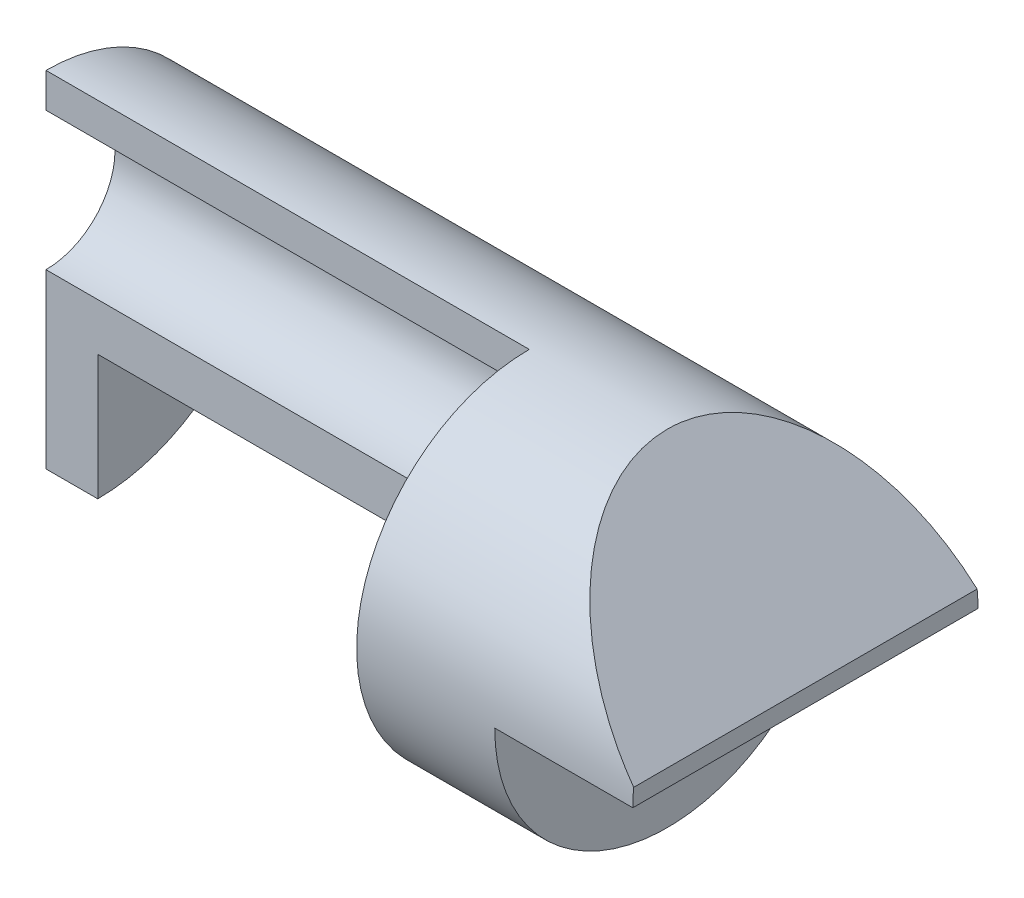
ISO-10303-21;
HEADER;
FILE_DESCRIPTION(('STEP AP214'),'2;1');
FILE_NAME('part.step','',(''),(''),'','','');
FILE_SCHEMA(('AUTOMOTIVE_DESIGN { 1 0 10303 214 1 1 1 1 }'));
ENDSEC;
DATA;
#1=APPLICATION_CONTEXT('core data for automotive mechanical design processes');
#2=APPLICATION_PROTOCOL_DEFINITION('international standard','automotive_design',2000,#1);
#3=PRODUCT_CONTEXT('',#1,'mechanical');
#4=PRODUCT('Part','Part','',(#3));
#5=PRODUCT_RELATED_PRODUCT_CATEGORY('part','',(#4));
#6=PRODUCT_DEFINITION_FORMATION('','',#4);
#7=PRODUCT_DEFINITION_CONTEXT('part definition',#1,'design');
#8=PRODUCT_DEFINITION('design','',#6,#7);
#9=PRODUCT_DEFINITION_SHAPE('','',#8);
#10=(LENGTH_UNIT() NAMED_UNIT(*) SI_UNIT(.MILLI.,.METRE.));
#11=(NAMED_UNIT(*) PLANE_ANGLE_UNIT() SI_UNIT($,.RADIAN.));
#12=(NAMED_UNIT(*) SI_UNIT($,.STERADIAN.) SOLID_ANGLE_UNIT());
#13=UNCERTAINTY_MEASURE_WITH_UNIT(LENGTH_MEASURE(1.E-05),#10,'distance_accuracy_value','');
#14=(GEOMETRIC_REPRESENTATION_CONTEXT(3) GLOBAL_UNCERTAINTY_ASSIGNED_CONTEXT((#13)) GLOBAL_UNIT_ASSIGNED_CONTEXT((#10,
#11,#12)) REPRESENTATION_CONTEXT('',''));
#15=CARTESIAN_POINT('',(0.,0.,0.));
#16=DIRECTION('',(0.,0.,1.));
#17=DIRECTION('',(1.,0.,0.));
#18=AXIS2_PLACEMENT_3D('',#15,#16,#17);
#19=CARTESIAN_POINT('',(0.,-5.,0.));
#20=DIRECTION('',(0.,0.,1.));
#21=DIRECTION('',(1.,0.,0.));
#22=AXIS2_PLACEMENT_3D('',#19,#20,#21);
#23=PLANE('',#22);
#24=DIRECTION('',(1.,0.,0.));
#25=VECTOR('',#24,1.);
#26=CARTESIAN_POINT('',(0.,-5.,0.));
#27=LINE('',#26,#25);
#28=CARTESIAN_POINT('',(0.,-5.,0.));
#29=VERTEX_POINT('',#28);
#30=CARTESIAN_POINT('',(1.5,-5.,0.));
#31=VERTEX_POINT('',#30);
#32=EDGE_CURVE('E135',#29,#31,#27,.T.);
#33=ORIENTED_EDGE('',*,*,#32,.T.);
#34=DIRECTION('',(0.,1.,0.));
#35=VECTOR('',#34,1.);
#36=CARTESIAN_POINT('',(1.5,-5.,0.));
#37=LINE('',#36,#35);
#38=CARTESIAN_POINT('',(1.5,-1.37208889847052,0.));
#39=VERTEX_POINT('',#38);
#40=EDGE_CURVE('E121',#31,#39,#37,.T.);
#41=ORIENTED_EDGE('',*,*,#40,.T.);
#42=DIRECTION('',(1.,0.,0.));
#43=VECTOR('',#42,1.);
#44=CARTESIAN_POINT('',(1.5,-1.37208889847052,0.));
#45=LINE('',#44,#43);
#46=CARTESIAN_POINT('',(12.,-1.37208889847052,0.));
#47=VERTEX_POINT('',#46);
#48=EDGE_CURVE('E127',#39,#47,#45,.T.);
#49=ORIENTED_EDGE('',*,*,#48,.T.);
#50=DIRECTION('',(0.,-1.,0.));
#51=VECTOR('',#50,1.);
#52=CARTESIAN_POINT('',(12.,-1.37208889847052,0.));
#53=LINE('',#52,#51);
#54=CARTESIAN_POINT('',(12.,-5.,0.));
#55=VERTEX_POINT('',#54);
#56=EDGE_CURVE('E131',#47,#55,#53,.T.);
#57=ORIENTED_EDGE('',*,*,#56,.T.);
#58=CARTESIAN_POINT('',(14.,-5.,0.));
#59=VERTEX_POINT('',#58);
#60=EDGE_CURVE('E152',#55,#59,#27,.T.);
#61=ORIENTED_EDGE('',*,*,#60,.T.);
#62=DIRECTION('',(0.,1.,0.));
#63=VECTOR('',#62,1.);
#64=CARTESIAN_POINT('',(14.,-5.,0.));
#65=LINE('',#64,#63);
#66=CARTESIAN_POINT('',(14.,0.,0.));
#67=VERTEX_POINT('',#66);
#68=EDGE_CURVE('E160',#59,#67,#65,.T.);
#69=ORIENTED_EDGE('',*,*,#68,.T.);
#70=DIRECTION('',(1.,0.,0.));
#71=VECTOR('',#70,1.);
#72=CARTESIAN_POINT('',(-1.2E-05,0.,0.));
#73=LINE('',#72,#71);
#74=CARTESIAN_POINT('',(0.,0.,0.));
#75=VERTEX_POINT('',#74);
#76=EDGE_CURVE('E64',#67,#75,#73,.F.);
#77=ORIENTED_EDGE('',*,*,#76,.T.);
#78=DIRECTION('',(0.,1.,0.));
#79=VECTOR('',#78,1.);
#80=CARTESIAN_POINT('',(0.,-5.,0.));
#81=LINE('',#80,#79);
#82=EDGE_CURVE('E155',#29,#75,#81,.T.);
#83=ORIENTED_EDGE('',*,*,#82,.F.);
#84=EDGE_LOOP('',(#33,#41,#49,#57,#61,#69,#77,#83));
#85=FACE_BOUND('',#84,.T.);
#86=ADVANCED_FACE('F41',(#85),#23,.T.);
#87=CARTESIAN_POINT('',(22.,0.,0.));
#88=DIRECTION('',(1.,0.,0.));
#89=DIRECTION('',(0.,1.,0.));
#90=AXIS2_PLACEMENT_3D('',#87,#88,#89);
#91=CYLINDRICAL_SURFACE('',#90,5.);
#92=CARTESIAN_POINT('',(22.,0.,0.));
#93=DIRECTION('',(1.,0.,0.));
#94=DIRECTION('',(0.,1.,0.));
#95=AXIS2_PLACEMENT_3D('',#92,#93,#94);
#96=CIRCLE('',#95,5.);
#97=CARTESIAN_POINT('',(22.,0.,-5.));
#98=VERTEX_POINT('',#97);
#99=CARTESIAN_POINT('',(22.,0.500000000000002,-4.9749371855331));
#100=VERTEX_POINT('',#99);
#101=EDGE_CURVE('E173',#98,#100,#96,.T.);
#102=ORIENTED_EDGE('',*,*,#101,.F.);
#103=DIRECTION('',(1.,0.,0.));
#104=VECTOR('',#103,1.);
#105=CARTESIAN_POINT('',(18.,0.,-5.));
#106=LINE('',#105,#104);
#107=CARTESIAN_POINT('',(18.,0.,-5.));
#108=VERTEX_POINT('',#107);
#109=EDGE_CURVE('E165',#108,#98,#106,.T.);
#110=ORIENTED_EDGE('',*,*,#109,.F.);
#111=CARTESIAN_POINT('',(18.,0.,0.));
#112=DIRECTION('',(1.,0.,0.));
#113=DIRECTION('',(0.,0.,-1.));
#114=AXIS2_PLACEMENT_3D('',#111,#112,#113);
#115=CIRCLE('',#114,5.);
#116=CARTESIAN_POINT('',(18.,0.,5.));
#117=VERTEX_POINT('',#116);
#118=EDGE_CURVE('E183',#108,#117,#115,.F.);
#119=ORIENTED_EDGE('',*,*,#118,.T.);
#120=DIRECTION('',(1.,0.,0.));
#121=VECTOR('',#120,1.);
#122=CARTESIAN_POINT('',(18.,0.,5.));
#123=LINE('',#122,#121);
#124=CARTESIAN_POINT('',(22.,0.,5.));
#125=VERTEX_POINT('',#124);
#126=EDGE_CURVE('E158',#117,#125,#123,.T.);
#127=ORIENTED_EDGE('',*,*,#126,.T.);
#128=CARTESIAN_POINT('',(22.,0.500000000000001,4.9749371855331));
#129=VERTEX_POINT('',#128);
#130=EDGE_CURVE('E176',#129,#125,#96,.T.);
#131=ORIENTED_EDGE('',*,*,#130,.F.);
#132=CARTESIAN_POINT('',(22.4444444444444,0.,0.));
#133=DIRECTION('',(0.74740931868366,0.66436383882992,0.));
#134=DIRECTION('',(0.66436383882992,-0.74740931868366,0.));
#135=AXIS2_PLACEMENT_3D('',#132,#133,#134);
#136=ELLIPSE('',#135,6.68977476599572,5.);
#137=EDGE_CURVE('E171',#129,#100,#136,.F.);
#138=ORIENTED_EDGE('',*,*,#137,.T.);
#139=EDGE_LOOP('',(#102,#110,#119,#127,#131,#138));
#140=FACE_BOUND('',#139,.T.);
#141=DIRECTION('',(1.,0.,0.));
#142=VECTOR('',#141,1.);
#143=CARTESIAN_POINT('',(22.,-1.37208889847052,-4.80805283401649));
#144=LINE('',#143,#142);
#145=CARTESIAN_POINT('',(12.,-1.37208889847052,-4.80805283401649));
#146=VERTEX_POINT('',#145);
#147=CARTESIAN_POINT('',(1.5,-1.37208889847052,-4.80805283401648));
#148=VERTEX_POINT('',#147);
#149=EDGE_CURVE('E49',#146,#148,#144,.F.);
#150=ORIENTED_EDGE('',*,*,#149,.T.);
#151=CARTESIAN_POINT('',(1.5,0.,0.));
#152=DIRECTION('',(1.,0.,0.));
#153=DIRECTION('',(0.,0.,-1.));
#154=AXIS2_PLACEMENT_3D('',#151,#152,#153);
#155=CIRCLE('',#154,5.);
#156=EDGE_CURVE('E11',#148,#31,#155,.F.);
#157=ORIENTED_EDGE('',*,*,#156,.T.);
#158=ORIENTED_EDGE('',*,*,#32,.F.);
#159=CARTESIAN_POINT('',(0.,0.,0.));
#160=DIRECTION('',(1.,0.,0.));
#161=DIRECTION('',(0.,1.,0.));
#162=AXIS2_PLACEMENT_3D('',#159,#160,#161);
#163=CIRCLE('',#162,5.);
#164=CARTESIAN_POINT('',(0.,5.,0.));
#165=VERTEX_POINT('',#164);
#166=EDGE_CURVE('E177',#29,#165,#163,.T.);
#167=ORIENTED_EDGE('',*,*,#166,.T.);
#168=DIRECTION('',(1.,0.,0.));
#169=VECTOR('',#168,1.);
#170=CARTESIAN_POINT('',(0.,5.,0.));
#171=LINE('',#170,#169);
#172=CARTESIAN_POINT('',(14.,5.,0.));
#173=VERTEX_POINT('',#172);
#174=EDGE_CURVE('E149',#165,#173,#171,.T.);
#175=ORIENTED_EDGE('',*,*,#174,.T.);
#176=CARTESIAN_POINT('',(14.,0.,0.));
#177=DIRECTION('',(-1.,0.,0.));
#178=DIRECTION('',(0.,0.,1.));
#179=AXIS2_PLACEMENT_3D('',#176,#177,#178);
#180=CIRCLE('',#179,5.);
#181=EDGE_CURVE('E186',#173,#59,#180,.F.);
#182=ORIENTED_EDGE('',*,*,#181,.T.);
#183=ORIENTED_EDGE('',*,*,#60,.F.);
#184=CARTESIAN_POINT('',(12.,0.,0.));
#185=DIRECTION('',(-1.,0.,0.));
#186=DIRECTION('',(0.,0.,1.));
#187=AXIS2_PLACEMENT_3D('',#184,#185,#186);
#188=CIRCLE('',#187,5.);
#189=EDGE_CURVE('E191',#55,#146,#188,.F.);
#190=ORIENTED_EDGE('',*,*,#189,.T.);
#191=EDGE_LOOP('',(#150,#157,#158,#167,#175,#182,#183,#190));
#192=FACE_BOUND('',#191,.T.);
#193=ADVANCED_FACE('F194',(#140,#192),#91,.T.);
#194=CARTESIAN_POINT('',(0.,4.,0.));
#195=VERTEX_POINT('',#194);
#196=EDGE_CURVE('E159',#195,#165,#81,.T.);
#197=ORIENTED_EDGE('',*,*,#196,.F.);
#198=DIRECTION('',(1.,0.,0.));
#199=VECTOR('',#198,1.);
#200=CARTESIAN_POINT('',(-1.20000000000804E-05,4.,0.));
#201=LINE('',#200,#199);
#202=CARTESIAN_POINT('',(14.,4.,0.));
#203=VERTEX_POINT('',#202);
#204=EDGE_CURVE('E142',#195,#203,#201,.T.);
#205=ORIENTED_EDGE('',*,*,#204,.T.);
#206=EDGE_CURVE('E154',#203,#173,#65,.T.);
#207=ORIENTED_EDGE('',*,*,#206,.T.);
#208=ORIENTED_EDGE('',*,*,#174,.F.);
#209=EDGE_LOOP('',(#197,#205,#207,#208));
#210=FACE_BOUND('',#209,.T.);
#211=ADVANCED_FACE('F207',(#210),#23,.T.);
#212=CARTESIAN_POINT('',(0.,0.,0.));
#213=DIRECTION('',(-1.,0.,0.));
#214=DIRECTION('',(0.,-1.,0.));
#215=AXIS2_PLACEMENT_3D('',#212,#213,#214);
#216=PLANE('',#215);
#217=ORIENTED_EDGE('',*,*,#82,.T.);
#218=CARTESIAN_POINT('',(0.,2.,0.));
#219=DIRECTION('',(-1.,0.,0.));
#220=DIRECTION('',(0.,-1.,0.));
#221=AXIS2_PLACEMENT_3D('',#218,#219,#220);
#222=CIRCLE('',#221,2.);
#223=EDGE_CURVE('E146',#75,#195,#222,.F.);
#224=ORIENTED_EDGE('',*,*,#223,.T.);
#225=ORIENTED_EDGE('',*,*,#196,.T.);
#226=ORIENTED_EDGE('',*,*,#166,.F.);
#227=EDGE_LOOP('',(#217,#224,#225,#226));
#228=FACE_BOUND('',#227,.T.);
#229=ADVANCED_FACE('F43',(#228),#216,.T.);
#230=CARTESIAN_POINT('',(22.,5.,0.));
#231=DIRECTION('',(1.,0.,0.));
#232=DIRECTION('',(0.,1.,0.));
#233=AXIS2_PLACEMENT_3D('',#230,#231,#232);
#234=PLANE('',#233);
#235=ORIENTED_EDGE('',*,*,#130,.T.);
#236=DIRECTION('',(0.,0.,1.));
#237=VECTOR('',#236,1.);
#238=CARTESIAN_POINT('',(22.,0.,-5.));
#239=LINE('',#238,#237);
#240=EDGE_CURVE('E169',#98,#125,#239,.T.);
#241=ORIENTED_EDGE('',*,*,#240,.F.);
#242=ORIENTED_EDGE('',*,*,#101,.T.);
#243=DIRECTION('',(0.,0.,1.));
#244=VECTOR('',#243,1.);
#245=CARTESIAN_POINT('',(22.,0.500000000000001,0.));
#246=LINE('',#245,#244);
#247=EDGE_CURVE('E180',#100,#129,#246,.T.);
#248=ORIENTED_EDGE('',*,*,#247,.T.);
#249=EDGE_LOOP('',(#235,#241,#242,#248));
#250=FACE_BOUND('',#249,.T.);
#251=ADVANCED_FACE('F211',(#250),#234,.T.);
#252=CARTESIAN_POINT('',(22.,0.500000000000002,-5.));
#253=DIRECTION('',(0.74740931868366,0.66436383882992,0.));
#254=DIRECTION('',(-0.66436383882992,0.74740931868366,0.));
#255=AXIS2_PLACEMENT_3D('',#252,#253,#254);
#256=PLANE('',#255);
#257=ORIENTED_EDGE('',*,*,#247,.F.);
#258=ORIENTED_EDGE('',*,*,#137,.F.);
#259=EDGE_LOOP('',(#257,#258));
#260=FACE_BOUND('',#259,.T.);
#261=ADVANCED_FACE('F217',(#260),#256,.T.);
#262=CARTESIAN_POINT('',(18.,0.,-5.));
#263=DIRECTION('',(0.,-1.,0.));
#264=DIRECTION('',(0.,0.,-1.));
#265=AXIS2_PLACEMENT_3D('',#262,#263,#264);
#266=PLANE('',#265);
#267=DIRECTION('',(0.,0.,1.));
#268=VECTOR('',#267,1.);
#269=CARTESIAN_POINT('',(18.,0.,-5.));
#270=LINE('',#269,#268);
#271=EDGE_CURVE('E167',#108,#117,#270,.T.);
#272=ORIENTED_EDGE('',*,*,#271,.F.);
#273=ORIENTED_EDGE('',*,*,#109,.T.);
#274=ORIENTED_EDGE('',*,*,#240,.T.);
#275=ORIENTED_EDGE('',*,*,#126,.F.);
#276=EDGE_LOOP('',(#272,#273,#274,#275));
#277=FACE_BOUND('',#276,.T.);
#278=ADVANCED_FACE('F234',(#277),#266,.T.);
#279=CARTESIAN_POINT('',(18.,-5.,-5.));
#280=DIRECTION('',(1.,0.,0.));
#281=DIRECTION('',(0.,0.,-1.));
#282=AXIS2_PLACEMENT_3D('',#279,#280,#281);
#283=PLANE('',#282);
#284=ORIENTED_EDGE('',*,*,#271,.T.);
#285=ORIENTED_EDGE('',*,*,#118,.F.);
#286=EDGE_LOOP('',(#284,#285));
#287=FACE_BOUND('',#286,.T.);
#288=ADVANCED_FACE('F231',(#287),#283,.T.);
#289=CARTESIAN_POINT('',(14.,-5.,0.));
#290=DIRECTION('',(-1.,0.,0.));
#291=DIRECTION('',(0.,0.,1.));
#292=AXIS2_PLACEMENT_3D('',#289,#290,#291);
#293=PLANE('',#292);
#294=ORIENTED_EDGE('',*,*,#206,.F.);
#295=CARTESIAN_POINT('',(14.,2.,0.));
#296=DIRECTION('',(-1.,0.,0.));
#297=DIRECTION('',(0.,0.,1.));
#298=AXIS2_PLACEMENT_3D('',#295,#296,#297);
#299=CIRCLE('',#298,2.);
#300=EDGE_CURVE('E189',#203,#67,#299,.F.);
#301=ORIENTED_EDGE('',*,*,#300,.T.);
#302=ORIENTED_EDGE('',*,*,#68,.F.);
#303=ORIENTED_EDGE('',*,*,#181,.F.);
#304=EDGE_LOOP('',(#294,#301,#302,#303));
#305=FACE_BOUND('',#304,.T.);
#306=ADVANCED_FACE('F202',(#305),#293,.T.);
#307=CARTESIAN_POINT('',(-1.20000000000402E-05,2.,0.));
#308=DIRECTION('',(1.,0.,0.));
#309=DIRECTION('',(0.,1.,0.));
#310=AXIS2_PLACEMENT_3D('',#307,#308,#309);
#311=CYLINDRICAL_SURFACE('',#310,2.);
#312=ORIENTED_EDGE('',*,*,#76,.F.);
#313=ORIENTED_EDGE('',*,*,#300,.F.);
#314=ORIENTED_EDGE('',*,*,#204,.F.);
#315=ORIENTED_EDGE('',*,*,#223,.F.);
#316=EDGE_LOOP('',(#312,#313,#314,#315));
#317=FACE_BOUND('',#316,.T.);
#318=CARTESIAN_POINT('',(16.,2.,0.));
#319=DIRECTION('',(-1.,0.,0.));
#320=DIRECTION('',(0.,-1.,0.));
#321=AXIS2_PLACEMENT_3D('',#318,#319,#320);
#322=CIRCLE('',#321,2.);
#323=CARTESIAN_POINT('',(16.,0.,0.));
#324=VERTEX_POINT('',#323);
#325=EDGE_CURVE('E124',#324,#324,#322,.T.);
#326=ORIENTED_EDGE('',*,*,#325,.F.);
#327=EDGE_LOOP('',(#326));
#328=FACE_BOUND('',#327,.T.);
#329=ADVANCED_FACE('F203',(#317,#328),#311,.F.);
#330=CARTESIAN_POINT('',(16.,2.,0.));
#331=DIRECTION('',(-1.,0.,0.));
#332=DIRECTION('',(0.,-1.,0.));
#333=AXIS2_PLACEMENT_3D('',#330,#331,#332);
#334=PLANE('',#333);
#335=ORIENTED_EDGE('',*,*,#325,.T.);
#336=EDGE_LOOP('',(#335));
#337=FACE_BOUND('',#336,.T.);
#338=ADVANCED_FACE('F281',(#337),#334,.T.);
#339=CARTESIAN_POINT('',(1.5,-5.,-16.));
#340=DIRECTION('',(1.,0.,0.));
#341=DIRECTION('',(0.,0.,-1.));
#342=AXIS2_PLACEMENT_3D('',#339,#340,#341);
#343=PLANE('',#342);
#344=DIRECTION('',(0.,0.,1.));
#345=VECTOR('',#344,1.);
#346=CARTESIAN_POINT('',(1.5,-1.37208889847052,-16.));
#347=LINE('',#346,#345);
#348=EDGE_CURVE('E117',#148,#39,#347,.T.);
#349=ORIENTED_EDGE('',*,*,#348,.T.);
#350=ORIENTED_EDGE('',*,*,#40,.F.);
#351=ORIENTED_EDGE('',*,*,#156,.F.);
#352=EDGE_LOOP('',(#349,#350,#351));
#353=FACE_BOUND('',#352,.T.);
#354=ADVANCED_FACE('F119',(#353),#343,.T.);
#355=CARTESIAN_POINT('',(1.5,-1.37208889847052,-16.));
#356=DIRECTION('',(0.,-1.,0.));
#357=DIRECTION('',(0.,0.,-1.));
#358=AXIS2_PLACEMENT_3D('',#355,#356,#357);
#359=PLANE('',#358);
#360=DIRECTION('',(0.,0.,1.));
#361=VECTOR('',#360,1.);
#362=CARTESIAN_POINT('',(12.,-1.37208889847052,-16.));
#363=LINE('',#362,#361);
#364=EDGE_CURVE('E56',#146,#47,#363,.T.);
#365=ORIENTED_EDGE('',*,*,#364,.T.);
#366=ORIENTED_EDGE('',*,*,#48,.F.);
#367=ORIENTED_EDGE('',*,*,#348,.F.);
#368=ORIENTED_EDGE('',*,*,#149,.F.);
#369=EDGE_LOOP('',(#365,#366,#367,#368));
#370=FACE_BOUND('',#369,.T.);
#371=ADVANCED_FACE('F128',(#370),#359,.T.);
#372=CARTESIAN_POINT('',(12.,-1.37208889847052,-16.));
#373=DIRECTION('',(-1.,0.,0.));
#374=DIRECTION('',(0.,0.,1.));
#375=AXIS2_PLACEMENT_3D('',#372,#373,#374);
#376=PLANE('',#375);
#377=ORIENTED_EDGE('',*,*,#56,.F.);
#378=ORIENTED_EDGE('',*,*,#364,.F.);
#379=ORIENTED_EDGE('',*,*,#189,.F.);
#380=EDGE_LOOP('',(#377,#378,#379));
#381=FACE_BOUND('',#380,.T.);
#382=ADVANCED_FACE('F196',(#381),#376,.T.);
#383=CLOSED_SHELL('',(#86,#193,#211,#229,#251,#261,#278,#288,#306,#329,#338,#354,#371,#382));
#384=MANIFOLD_SOLID_BREP('B2',#383);
#385=ADVANCED_BREP_SHAPE_REPRESENTATION('',(#18,#384),#14);
#386=SHAPE_DEFINITION_REPRESENTATION(#9,#385);
ENDSEC;
END-ISO-10303-21;
